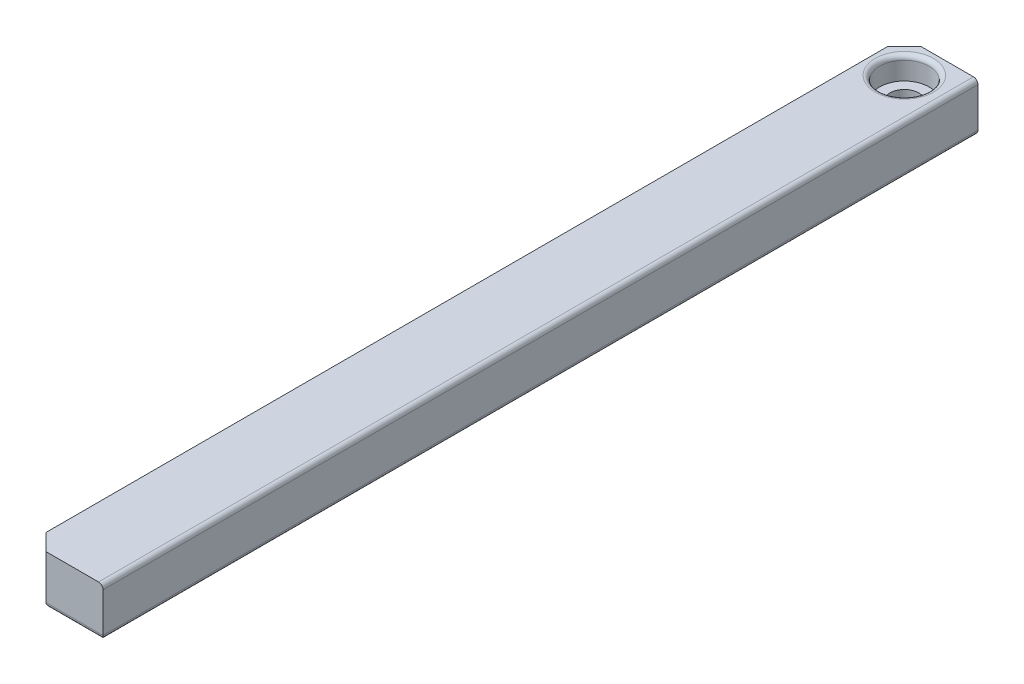
ISO-10303-21;
HEADER;
FILE_DESCRIPTION(('STEP AP214'),'2;1');
FILE_NAME('part.step','',(''),(''),'','','');
FILE_SCHEMA(('AUTOMOTIVE_DESIGN { 1 0 10303 214 1 1 1 1 }'));
ENDSEC;
DATA;
#1=APPLICATION_CONTEXT('core data for automotive mechanical design processes');
#2=APPLICATION_PROTOCOL_DEFINITION('international standard','automotive_design',2000,#1);
#3=PRODUCT_CONTEXT('',#1,'mechanical');
#4=PRODUCT('Part','Part','',(#3));
#5=PRODUCT_RELATED_PRODUCT_CATEGORY('part','',(#4));
#6=PRODUCT_DEFINITION_FORMATION('','',#4);
#7=PRODUCT_DEFINITION_CONTEXT('part definition',#1,'design');
#8=PRODUCT_DEFINITION('design','',#6,#7);
#9=PRODUCT_DEFINITION_SHAPE('','',#8);
#10=(LENGTH_UNIT() NAMED_UNIT(*) SI_UNIT(.MILLI.,.METRE.));
#11=(NAMED_UNIT(*) PLANE_ANGLE_UNIT() SI_UNIT($,.RADIAN.));
#12=(NAMED_UNIT(*) SI_UNIT($,.STERADIAN.) SOLID_ANGLE_UNIT());
#13=UNCERTAINTY_MEASURE_WITH_UNIT(LENGTH_MEASURE(1.E-05),#10,'distance_accuracy_value','');
#14=(GEOMETRIC_REPRESENTATION_CONTEXT(3) GLOBAL_UNCERTAINTY_ASSIGNED_CONTEXT((#13)) GLOBAL_UNIT_ASSIGNED_CONTEXT((#10,
#11,#12)) REPRESENTATION_CONTEXT('',''));
#15=CARTESIAN_POINT('',(0.,0.,0.));
#16=DIRECTION('',(0.,0.,1.));
#17=DIRECTION('',(1.,0.,0.));
#18=AXIS2_PLACEMENT_3D('',#15,#16,#17);
#19=CARTESIAN_POINT('',(25.459277076412,0.,-93.7));
#20=DIRECTION('',(0.,1.,0.));
#21=DIRECTION('',(0.,0.,1.));
#22=AXIS2_PLACEMENT_3D('',#19,#20,#21);
#23=CYLINDRICAL_SURFACE('',#22,1.6);
#24=CARTESIAN_POINT('',(25.459277076412,0.5,-93.7));
#25=DIRECTION('',(0.,1.,0.));
#26=DIRECTION('',(0.,0.,1.));
#27=AXIS2_PLACEMENT_3D('',#24,#25,#26);
#28=CIRCLE('',#27,1.6);
#29=CARTESIAN_POINT('',(25.459277076412,0.5,-92.1));
#30=VERTEX_POINT('',#29);
#31=EDGE_CURVE('E181',#30,#30,#28,.F.);
#32=CARTESIAN_POINT('',(25.459277076412,2.9,-93.7));
#33=DIRECTION('',(0.,1.,0.));
#34=DIRECTION('',(0.,0.,1.));
#35=AXIS2_PLACEMENT_3D('',#32,#33,#34);
#36=CIRCLE('',#35,1.6);
#37=CARTESIAN_POINT('',(25.459277076412,2.9,-92.1));
#38=VERTEX_POINT('',#37);
#39=EDGE_CURVE('E188',#38,#38,#36,.F.);
#40=CARTESIAN_POINT('',(25.459277076412,0.5,-92.1));
#41=CARTESIAN_POINT('',(25.459277076412,0.525,-92.1));
#42=CARTESIAN_POINT('',(25.459277076412,0.55,-92.1));
#43=CARTESIAN_POINT('',(25.459277076412,0.6,-92.1));
#44=CARTESIAN_POINT('',(25.459277076412,0.625,-92.1));
#45=CARTESIAN_POINT('',(25.459277076412,0.675,-92.1));
#46=CARTESIAN_POINT('',(25.459277076412,0.7,-92.1));
#47=CARTESIAN_POINT('',(25.459277076412,0.75,-92.1));
#48=CARTESIAN_POINT('',(25.459277076412,0.775,-92.1));
#49=CARTESIAN_POINT('',(25.459277076412,0.825,-92.1));
#50=CARTESIAN_POINT('',(25.459277076412,0.85,-92.1));
#51=CARTESIAN_POINT('',(25.459277076412,0.9,-92.1));
#52=CARTESIAN_POINT('',(25.459277076412,0.925,-92.1));
#53=CARTESIAN_POINT('',(25.459277076412,0.975,-92.1));
#54=CARTESIAN_POINT('',(25.459277076412,1.,-92.1));
#55=CARTESIAN_POINT('',(25.459277076412,1.05,-92.1));
#56=CARTESIAN_POINT('',(25.459277076412,1.075,-92.1));
#57=CARTESIAN_POINT('',(25.459277076412,1.125,-92.1));
#58=CARTESIAN_POINT('',(25.459277076412,1.15,-92.1));
#59=CARTESIAN_POINT('',(25.459277076412,1.2,-92.1));
#60=CARTESIAN_POINT('',(25.459277076412,1.225,-92.1));
#61=CARTESIAN_POINT('',(25.459277076412,1.275,-92.1));
#62=CARTESIAN_POINT('',(25.459277076412,1.3,-92.1));
#63=CARTESIAN_POINT('',(25.459277076412,1.35,-92.1));
#64=CARTESIAN_POINT('',(25.459277076412,1.375,-92.1));
#65=CARTESIAN_POINT('',(25.459277076412,1.425,-92.1));
#66=CARTESIAN_POINT('',(25.459277076412,1.45,-92.1));
#67=CARTESIAN_POINT('',(25.459277076412,1.5,-92.1));
#68=CARTESIAN_POINT('',(25.459277076412,1.525,-92.1));
#69=CARTESIAN_POINT('',(25.459277076412,1.575,-92.1));
#70=CARTESIAN_POINT('',(25.459277076412,1.6,-92.1));
#71=CARTESIAN_POINT('',(25.459277076412,1.65,-92.1));
#72=CARTESIAN_POINT('',(25.459277076412,1.675,-92.1));
#73=CARTESIAN_POINT('',(25.459277076412,1.725,-92.1));
#74=CARTESIAN_POINT('',(25.459277076412,1.75,-92.1));
#75=CARTESIAN_POINT('',(25.459277076412,1.8,-92.1));
#76=CARTESIAN_POINT('',(25.459277076412,1.825,-92.1));
#77=CARTESIAN_POINT('',(25.459277076412,1.875,-92.1));
#78=CARTESIAN_POINT('',(25.459277076412,1.9,-92.1));
#79=CARTESIAN_POINT('',(25.459277076412,1.95,-92.1));
#80=CARTESIAN_POINT('',(25.459277076412,1.975,-92.1));
#81=CARTESIAN_POINT('',(25.459277076412,2.025,-92.1));
#82=CARTESIAN_POINT('',(25.459277076412,2.05,-92.1));
#83=CARTESIAN_POINT('',(25.459277076412,2.1,-92.1));
#84=CARTESIAN_POINT('',(25.459277076412,2.125,-92.1));
#85=CARTESIAN_POINT('',(25.459277076412,2.175,-92.1));
#86=CARTESIAN_POINT('',(25.459277076412,2.2,-92.1));
#87=CARTESIAN_POINT('',(25.459277076412,2.25,-92.1));
#88=CARTESIAN_POINT('',(25.459277076412,2.275,-92.1));
#89=CARTESIAN_POINT('',(25.459277076412,2.325,-92.1));
#90=CARTESIAN_POINT('',(25.459277076412,2.35,-92.1));
#91=CARTESIAN_POINT('',(25.459277076412,2.4,-92.1));
#92=CARTESIAN_POINT('',(25.459277076412,2.425,-92.1));
#93=CARTESIAN_POINT('',(25.459277076412,2.475,-92.1));
#94=CARTESIAN_POINT('',(25.459277076412,2.5,-92.1));
#95=CARTESIAN_POINT('',(25.459277076412,2.55,-92.1));
#96=CARTESIAN_POINT('',(25.459277076412,2.575,-92.1));
#97=CARTESIAN_POINT('',(25.459277076412,2.625,-92.1));
#98=CARTESIAN_POINT('',(25.459277076412,2.65,-92.1));
#99=CARTESIAN_POINT('',(25.459277076412,2.7,-92.1));
#100=CARTESIAN_POINT('',(25.459277076412,2.725,-92.1));
#101=CARTESIAN_POINT('',(25.459277076412,2.775,-92.1));
#102=CARTESIAN_POINT('',(25.459277076412,2.8,-92.1));
#103=CARTESIAN_POINT('',(25.459277076412,2.85,-92.1));
#104=CARTESIAN_POINT('',(25.459277076412,2.875,-92.1));
#105=CARTESIAN_POINT('',(25.459277076412,2.9,-92.1));
#106=B_SPLINE_CURVE_WITH_KNOTS('',3,(#40,#41,#42,#43,#44,#45,#46,#47,#48,#49,#50,#51,#52,#53,
#54,#55,#56,#57,#58,#59,#60,#61,#62,#63,#64,#65,#66,#67,#68,#69,#70,#71,#72,#73,#74,#75,#76,#77,
#78,#79,#80,#81,#82,#83,#84,#85,#86,#87,#88,#89,#90,#91,#92,#93,#94,#95,#96,#97,#98,#99,#100,
#101,#102,#103,#104,#105),.UNSPECIFIED.,.F.,.F.,(4,2,2,2,2,2,2,2,2,2,2,2,2,2,2,2,2,2,2,2,2,2,2,
2,2,2,2,2,2,2,2,2,4),(0.,0.075,0.15,0.225,0.3,0.375,0.45,0.525,0.6,0.675,0.75,0.825,0.9,0.975,
1.05,1.125,1.2,1.275,1.35,1.425,1.5,1.575,1.65,1.725,1.8,1.875,1.95,2.025,2.1,2.175,2.25,2.325,
2.4),.UNSPECIFIED.);
#107=EDGE_CURVE('BSEAM35',#30,#38,#106,.T.);
#108=ORIENTED_EDGE('',*,*,#31,.T.);
#109=ORIENTED_EDGE('',*,*,#39,.F.);
#110=ORIENTED_EDGE('',*,*,#107,.T.);
#111=ORIENTED_EDGE('',*,*,#107,.F.);
#112=EDGE_LOOP('',(#108,#110,#109,#111));
#113=FACE_BOUND('',#112,.T.);
#114=ADVANCED_FACE('F35',(#113),#23,.F.);
#115=CARTESIAN_POINT('',(21.759277076412,5.4,-97.4));
#116=DIRECTION('',(1.,0.,0.));
#117=DIRECTION('',(0.,0.,-1.));
#118=AXIS2_PLACEMENT_3D('',#115,#116,#117);
#119=PLANE('',#118);
#120=DIRECTION('',(0.,1.,0.));
#121=VECTOR('',#120,1.);
#122=CARTESIAN_POINT('',(21.759277076412,0.,-95.55));
#123=LINE('',#122,#121);
#124=CARTESIAN_POINT('',(21.759277076412,0.5,-95.55));
#125=VERTEX_POINT('',#124);
#126=CARTESIAN_POINT('',(21.759277076412,5.4,-95.55));
#127=VERTEX_POINT('',#126);
#128=EDGE_CURVE('E112',#125,#127,#123,.T.);
#129=ORIENTED_EDGE('',*,*,#128,.F.);
#130=DIRECTION('',(0.,0.,1.));
#131=VECTOR('',#130,1.);
#132=CARTESIAN_POINT('',(21.759277076412,0.5,-97.4));
#133=LINE('',#132,#131);
#134=CARTESIAN_POINT('',(21.759277076412,0.5,-1.85));
#135=VERTEX_POINT('',#134);
#136=EDGE_CURVE('E179',#125,#135,#133,.T.);
#137=ORIENTED_EDGE('',*,*,#136,.T.);
#138=DIRECTION('',(0.,1.,0.));
#139=VECTOR('',#138,1.);
#140=CARTESIAN_POINT('',(21.759277076412,0.,-1.85));
#141=LINE('',#140,#139);
#142=CARTESIAN_POINT('',(21.759277076412,5.4,-1.85));
#143=VERTEX_POINT('',#142);
#144=EDGE_CURVE('E133',#135,#143,#141,.T.);
#145=ORIENTED_EDGE('',*,*,#144,.T.);
#146=DIRECTION('',(0.,0.,1.));
#147=VECTOR('',#146,1.);
#148=CARTESIAN_POINT('',(21.759277076412,5.4,-97.4));
#149=LINE('',#148,#147);
#150=EDGE_CURVE('E129',#127,#143,#149,.T.);
#151=ORIENTED_EDGE('',*,*,#150,.F.);
#152=EDGE_LOOP('',(#129,#137,#145,#151));
#153=FACE_BOUND('',#152,.T.);
#154=ADVANCED_FACE('F135',(#153),#119,.F.);
#155=CARTESIAN_POINT('',(21.759277076412,5.4,0.));
#156=DIRECTION('',(0.,0.,-1.));
#157=DIRECTION('',(-1.,0.,0.));
#158=AXIS2_PLACEMENT_3D('',#155,#156,#157);
#159=PLANE('',#158);
#160=DIRECTION('',(0.,-1.,0.));
#161=VECTOR('',#160,1.);
#162=CARTESIAN_POINT('',(29.959277076412,5.4,0.));
#163=LINE('',#162,#161);
#164=CARTESIAN_POINT('',(29.959277076412,4.9,0.));
#165=VERTEX_POINT('',#164);
#166=CARTESIAN_POINT('',(29.959277076412,0.500000000000002,0.));
#167=VERTEX_POINT('',#166);
#168=EDGE_CURVE('E149',#165,#167,#163,.T.);
#169=ORIENTED_EDGE('',*,*,#168,.F.);
#170=CARTESIAN_POINT('',(29.459277076412,4.9,0.));
#171=DIRECTION('',(0.,0.,-1.));
#172=DIRECTION('',(-1.,0.,0.));
#173=AXIS2_PLACEMENT_3D('',#170,#171,#172);
#174=CIRCLE('',#173,0.5);
#175=CARTESIAN_POINT('',(29.459277076412,5.4,0.));
#176=VERTEX_POINT('',#175);
#177=EDGE_CURVE('E206',#165,#176,#174,.F.);
#178=ORIENTED_EDGE('',*,*,#177,.T.);
#179=DIRECTION('',(1.,0.,0.));
#180=VECTOR('',#179,1.);
#181=CARTESIAN_POINT('',(21.759277076412,5.4,0.));
#182=LINE('',#181,#180);
#183=CARTESIAN_POINT('',(23.609277076412,5.4,0.));
#184=VERTEX_POINT('',#183);
#185=EDGE_CURVE('E138',#184,#176,#182,.T.);
#186=ORIENTED_EDGE('',*,*,#185,.F.);
#187=DIRECTION('',(0.,1.,0.));
#188=VECTOR('',#187,1.);
#189=CARTESIAN_POINT('',(23.609277076412,0.,0.));
#190=LINE('',#189,#188);
#191=CARTESIAN_POINT('',(23.609277076412,0.5,0.));
#192=VERTEX_POINT('',#191);
#193=EDGE_CURVE('E143',#192,#184,#190,.T.);
#194=ORIENTED_EDGE('',*,*,#193,.F.);
#195=DIRECTION('',(1.,0.,0.));
#196=VECTOR('',#195,1.);
#197=CARTESIAN_POINT('',(21.759277076412,0.5,0.));
#198=LINE('',#197,#196);
#199=EDGE_CURVE('E170',#192,#167,#198,.T.);
#200=ORIENTED_EDGE('',*,*,#199,.T.);
#201=EDGE_LOOP('',(#169,#178,#186,#194,#200));
#202=FACE_BOUND('',#201,.T.);
#203=ADVANCED_FACE('F230',(#202),#159,.F.);
#204=CARTESIAN_POINT('',(29.959277076412,5.4,0.));
#205=DIRECTION('',(-1.,0.,0.));
#206=DIRECTION('',(0.,0.,1.));
#207=AXIS2_PLACEMENT_3D('',#204,#205,#206);
#208=PLANE('',#207);
#209=DIRECTION('',(0.,-1.,0.));
#210=VECTOR('',#209,1.);
#211=CARTESIAN_POINT('',(29.959277076412,5.4,-97.4));
#212=LINE('',#211,#210);
#213=CARTESIAN_POINT('',(29.959277076412,4.9,-97.4));
#214=VERTEX_POINT('',#213);
#215=CARTESIAN_POINT('',(29.959277076412,0.500000000000002,-97.4));
#216=VERTEX_POINT('',#215);
#217=EDGE_CURVE('E147',#214,#216,#212,.T.);
#218=ORIENTED_EDGE('',*,*,#217,.F.);
#219=DIRECTION('',(0.,0.,-1.));
#220=VECTOR('',#219,1.);
#221=CARTESIAN_POINT('',(29.959277076412,4.9,0.));
#222=LINE('',#221,#220);
#223=EDGE_CURVE('E50',#214,#165,#222,.F.);
#224=ORIENTED_EDGE('',*,*,#223,.T.);
#225=ORIENTED_EDGE('',*,*,#168,.T.);
#226=DIRECTION('',(0.,0.,-1.));
#227=VECTOR('',#226,1.);
#228=CARTESIAN_POINT('',(29.959277076412,0.5,0.));
#229=LINE('',#228,#227);
#230=EDGE_CURVE('E173',#167,#216,#229,.T.);
#231=ORIENTED_EDGE('',*,*,#230,.T.);
#232=EDGE_LOOP('',(#218,#224,#225,#231));
#233=FACE_BOUND('',#232,.T.);
#234=ADVANCED_FACE('F247',(#233),#208,.F.);
#235=CARTESIAN_POINT('',(29.959277076412,5.4,-97.4));
#236=DIRECTION('',(0.,0.,1.));
#237=DIRECTION('',(1.,0.,0.));
#238=AXIS2_PLACEMENT_3D('',#235,#236,#237);
#239=PLANE('',#238);
#240=DIRECTION('',(-1.,0.,0.));
#241=VECTOR('',#240,1.);
#242=CARTESIAN_POINT('',(29.959277076412,5.4,-97.4));
#243=LINE('',#242,#241);
#244=CARTESIAN_POINT('',(29.459277076412,5.4,-97.4));
#245=VERTEX_POINT('',#244);
#246=CARTESIAN_POINT('',(23.609277076412,5.4,-97.4));
#247=VERTEX_POINT('',#246);
#248=EDGE_CURVE('E131',#245,#247,#243,.T.);
#249=ORIENTED_EDGE('',*,*,#248,.F.);
#250=CARTESIAN_POINT('',(29.459277076412,4.9,-97.4));
#251=DIRECTION('',(0.,0.,1.));
#252=DIRECTION('',(1.,0.,0.));
#253=AXIS2_PLACEMENT_3D('',#250,#251,#252);
#254=CIRCLE('',#253,0.5);
#255=EDGE_CURVE('E58',#245,#214,#254,.F.);
#256=ORIENTED_EDGE('',*,*,#255,.T.);
#257=ORIENTED_EDGE('',*,*,#217,.T.);
#258=DIRECTION('',(-1.,0.,0.));
#259=VECTOR('',#258,1.);
#260=CARTESIAN_POINT('',(29.959277076412,0.5,-97.4));
#261=LINE('',#260,#259);
#262=CARTESIAN_POINT('',(23.609277076412,0.5,-97.4));
#263=VERTEX_POINT('',#262);
#264=EDGE_CURVE('E176',#216,#263,#261,.T.);
#265=ORIENTED_EDGE('',*,*,#264,.T.);
#266=DIRECTION('',(0.,1.,0.));
#267=VECTOR('',#266,1.);
#268=CARTESIAN_POINT('',(23.609277076412,0.,-97.4));
#269=LINE('',#268,#267);
#270=EDGE_CURVE('E122',#263,#247,#269,.T.);
#271=ORIENTED_EDGE('',*,*,#270,.T.);
#272=EDGE_LOOP('',(#249,#256,#257,#265,#271));
#273=FACE_BOUND('',#272,.T.);
#274=ADVANCED_FACE('F240',(#273),#239,.F.);
#275=CARTESIAN_POINT('',(0.,5.4,0.));
#276=DIRECTION('',(0.,1.,0.));
#277=DIRECTION('',(0.,0.,1.));
#278=AXIS2_PLACEMENT_3D('',#275,#276,#277);
#279=PLANE('',#278);
#280=CARTESIAN_POINT('',(25.459277076412,5.4,-93.7));
#281=DIRECTION('',(0.,1.,0.));
#282=DIRECTION('',(0.,0.,1.));
#283=AXIS2_PLACEMENT_3D('',#280,#281,#282);
#284=CIRCLE('',#283,3.25);
#285=CARTESIAN_POINT('',(25.459277076412,5.4,-90.45));
#286=VERTEX_POINT('',#285);
#287=EDGE_CURVE('E11',#286,#286,#284,.F.);
#288=ORIENTED_EDGE('',*,*,#287,.T.);
#289=EDGE_LOOP('',(#288));
#290=FACE_BOUND('',#289,.T.);
#291=ORIENTED_EDGE('',*,*,#185,.T.);
#292=DIRECTION('',(0.,0.,-1.));
#293=VECTOR('',#292,1.);
#294=CARTESIAN_POINT('',(29.459277076412,5.4,-97.4));
#295=LINE('',#294,#293);
#296=EDGE_CURVE('E184',#176,#245,#295,.T.);
#297=ORIENTED_EDGE('',*,*,#296,.T.);
#298=ORIENTED_EDGE('',*,*,#248,.T.);
#299=DIRECTION('',(0.707106781186547,0.,-0.707106781186548));
#300=VECTOR('',#299,1.);
#301=CARTESIAN_POINT('',(21.759277076412,5.4,-95.55));
#302=LINE('',#301,#300);
#303=EDGE_CURVE('E116',#127,#247,#302,.T.);
#304=ORIENTED_EDGE('',*,*,#303,.F.);
#305=ORIENTED_EDGE('',*,*,#150,.T.);
#306=DIRECTION('',(-0.707106781186547,0.,-0.707106781186548));
#307=VECTOR('',#306,1.);
#308=CARTESIAN_POINT('',(21.759277076412,5.4,-1.85));
#309=LINE('',#308,#307);
#310=EDGE_CURVE('E202',#184,#143,#309,.T.);
#311=ORIENTED_EDGE('',*,*,#310,.F.);
#312=EDGE_LOOP('',(#291,#297,#298,#304,#305,#311));
#313=FACE_BOUND('',#312,.T.);
#314=ADVANCED_FACE('F127',(#290,#313),#279,.T.);
#315=CARTESIAN_POINT('',(0.,0.,0.));
#316=DIRECTION('',(0.,1.,0.));
#317=DIRECTION('',(0.,0.,1.));
#318=AXIS2_PLACEMENT_3D('',#315,#316,#317);
#319=PLANE('',#318);
#320=DIRECTION('',(1.,0.,0.));
#321=VECTOR('',#320,1.);
#322=CARTESIAN_POINT('',(0.,0.,-0.5));
#323=LINE('',#322,#321);
#324=CARTESIAN_POINT('',(29.459277076412,0.,-0.5));
#325=VERTEX_POINT('',#324);
#326=CARTESIAN_POINT('',(23.8163838575986,0.,-0.5));
#327=VERTEX_POINT('',#326);
#328=EDGE_CURVE('E162',#325,#327,#323,.F.);
#329=ORIENTED_EDGE('',*,*,#328,.T.);
#330=DIRECTION('',(-0.707106781186547,0.,-0.707106781186548));
#331=VECTOR('',#330,1.);
#332=CARTESIAN_POINT('',(12.1581919287993,0.,-12.1581919287993));
#333=LINE('',#332,#331);
#334=CARTESIAN_POINT('',(22.259277076412,0.,-2.05710678118655));
#335=VERTEX_POINT('',#334);
#336=EDGE_CURVE('E164',#327,#335,#333,.T.);
#337=ORIENTED_EDGE('',*,*,#336,.T.);
#338=DIRECTION('',(0.,0.,1.));
#339=VECTOR('',#338,1.);
#340=CARTESIAN_POINT('',(22.259277076412,0.,0.));
#341=LINE('',#340,#339);
#342=CARTESIAN_POINT('',(22.259277076412,0.,-95.3428932188135));
#343=VERTEX_POINT('',#342);
#344=EDGE_CURVE('E154',#335,#343,#341,.F.);
#345=ORIENTED_EDGE('',*,*,#344,.T.);
#346=DIRECTION('',(0.707106781186547,0.,-0.707106781186548));
#347=VECTOR('',#346,1.);
#348=CARTESIAN_POINT('',(-36.5418080712007,0.,-36.5418080712006));
#349=LINE('',#348,#347);
#350=CARTESIAN_POINT('',(23.8163838575986,0.,-96.9));
#351=VERTEX_POINT('',#350);
#352=EDGE_CURVE('E156',#343,#351,#349,.T.);
#353=ORIENTED_EDGE('',*,*,#352,.T.);
#354=DIRECTION('',(-1.,0.,0.));
#355=VECTOR('',#354,1.);
#356=CARTESIAN_POINT('',(0.,0.,-96.9));
#357=LINE('',#356,#355);
#358=CARTESIAN_POINT('',(29.459277076412,0.,-96.9));
#359=VERTEX_POINT('',#358);
#360=EDGE_CURVE('E158',#351,#359,#357,.F.);
#361=ORIENTED_EDGE('',*,*,#360,.T.);
#362=DIRECTION('',(0.,0.,-1.));
#363=VECTOR('',#362,1.);
#364=CARTESIAN_POINT('',(29.459277076412,0.,0.));
#365=LINE('',#364,#363);
#366=EDGE_CURVE('E160',#359,#325,#365,.F.);
#367=ORIENTED_EDGE('',*,*,#366,.T.);
#368=EDGE_LOOP('',(#329,#337,#345,#353,#361,#367));
#369=FACE_BOUND('',#368,.T.);
#370=CARTESIAN_POINT('',(25.459277076412,0.,-93.7));
#371=DIRECTION('',(0.,1.,0.));
#372=DIRECTION('',(0.,0.,1.));
#373=AXIS2_PLACEMENT_3D('',#370,#371,#372);
#374=CIRCLE('',#373,2.1);
#375=CARTESIAN_POINT('',(25.459277076412,0.,-91.6));
#376=VERTEX_POINT('',#375);
#377=EDGE_CURVE('E151',#376,#376,#374,.T.);
#378=ORIENTED_EDGE('',*,*,#377,.T.);
#379=EDGE_LOOP('',(#378));
#380=FACE_BOUND('',#379,.T.);
#381=ADVANCED_FACE('F239',(#369,#380),#319,.F.);
#382=CARTESIAN_POINT('',(21.759277076412,0.,-1.85));
#383=DIRECTION('',(0.707106781186548,0.,-0.707106781186547));
#384=DIRECTION('',(-0.707106781186547,0.,-0.707106781186548));
#385=AXIS2_PLACEMENT_3D('',#382,#383,#384);
#386=PLANE('',#385);
#387=ORIENTED_EDGE('',*,*,#144,.F.);
#388=DIRECTION('',(-0.707106781186547,0.,-0.707106781186548));
#389=VECTOR('',#388,1.);
#390=CARTESIAN_POINT('',(21.759277076412,0.5,-1.85));
#391=LINE('',#390,#389);
#392=EDGE_CURVE('E167',#135,#192,#391,.F.);
#393=ORIENTED_EDGE('',*,*,#392,.T.);
#394=ORIENTED_EDGE('',*,*,#193,.T.);
#395=ORIENTED_EDGE('',*,*,#310,.T.);
#396=EDGE_LOOP('',(#387,#393,#394,#395));
#397=FACE_BOUND('',#396,.T.);
#398=ADVANCED_FACE('F235',(#397),#386,.F.);
#399=CARTESIAN_POINT('',(21.759277076412,0.,-95.55));
#400=DIRECTION('',(0.707106781186548,0.,0.707106781186547));
#401=DIRECTION('',(0.707106781186547,0.,-0.707106781186548));
#402=AXIS2_PLACEMENT_3D('',#399,#400,#401);
#403=PLANE('',#402);
#404=ORIENTED_EDGE('',*,*,#270,.F.);
#405=DIRECTION('',(0.707106781186547,0.,-0.707106781186548));
#406=VECTOR('',#405,1.);
#407=CARTESIAN_POINT('',(21.759277076412,0.5,-95.55));
#408=LINE('',#407,#406);
#409=EDGE_CURVE('E118',#263,#125,#408,.F.);
#410=ORIENTED_EDGE('',*,*,#409,.T.);
#411=ORIENTED_EDGE('',*,*,#128,.T.);
#412=ORIENTED_EDGE('',*,*,#303,.T.);
#413=EDGE_LOOP('',(#404,#410,#411,#412));
#414=FACE_BOUND('',#413,.T.);
#415=ADVANCED_FACE('F115',(#414),#403,.F.);
#416=CARTESIAN_POINT('',(29.959277076412,0.5,-96.9));
#417=DIRECTION('',(-1.,0.,0.));
#418=DIRECTION('',(0.,0.,1.));
#419=AXIS2_PLACEMENT_3D('',#416,#417,#418);
#420=CYLINDRICAL_SURFACE('',#419,0.5);
#421=CARTESIAN_POINT('',(23.8163838575986,0.5,-96.9));
#422=DIRECTION('',(0.923879532511287,0.,-0.38268343236509));
#423=DIRECTION('',(-0.38268343236509,0.,-0.923879532511287));
#424=AXIS2_PLACEMENT_3D('',#421,#422,#423);
#425=ELLIPSE('',#424,0.541196100146197,0.5);
#426=EDGE_CURVE('E196',#263,#351,#425,.F.);
#427=ORIENTED_EDGE('',*,*,#426,.F.);
#428=ORIENTED_EDGE('',*,*,#264,.F.);
#429=CARTESIAN_POINT('',(29.459277076412,0.5,-96.9));
#430=DIRECTION('',(-0.707106781186547,0.,-0.707106781186547));
#431=DIRECTION('',(-0.707106781186547,0.,0.707106781186547));
#432=AXIS2_PLACEMENT_3D('',#429,#430,#431);
#433=ELLIPSE('',#432,0.707106781186547,0.5);
#434=EDGE_CURVE('E199',#359,#216,#433,.F.);
#435=ORIENTED_EDGE('',*,*,#434,.F.);
#436=ORIENTED_EDGE('',*,*,#360,.F.);
#437=EDGE_LOOP('',(#427,#428,#435,#436));
#438=FACE_BOUND('',#437,.T.);
#439=ADVANCED_FACE('F273',(#438),#420,.T.);
#440=CARTESIAN_POINT('',(29.459277076412,0.5,0.));
#441=DIRECTION('',(0.,0.,-1.));
#442=DIRECTION('',(-1.,0.,0.));
#443=AXIS2_PLACEMENT_3D('',#440,#441,#442);
#444=CYLINDRICAL_SURFACE('',#443,0.5);
#445=ORIENTED_EDGE('',*,*,#434,.T.);
#446=ORIENTED_EDGE('',*,*,#230,.F.);
#447=CARTESIAN_POINT('',(29.459277076412,0.5,-0.5));
#448=DIRECTION('',(0.707106781186547,0.,-0.707106781186547));
#449=DIRECTION('',(-0.707106781186547,0.,-0.707106781186547));
#450=AXIS2_PLACEMENT_3D('',#447,#448,#449);
#451=ELLIPSE('',#450,0.707106781186547,0.5);
#452=EDGE_CURVE('E193',#325,#167,#451,.F.);
#453=ORIENTED_EDGE('',*,*,#452,.F.);
#454=ORIENTED_EDGE('',*,*,#366,.F.);
#455=EDGE_LOOP('',(#445,#446,#453,#454));
#456=FACE_BOUND('',#455,.T.);
#457=ADVANCED_FACE('F269',(#456),#444,.T.);
#458=CARTESIAN_POINT('',(-36.5418080712007,0.5,-36.5418080712006));
#459=DIRECTION('',(0.707106781186547,0.,-0.707106781186548));
#460=DIRECTION('',(-0.707106781186548,0.,-0.707106781186547));
#461=AXIS2_PLACEMENT_3D('',#458,#459,#460);
#462=CYLINDRICAL_SURFACE('',#461,0.5);
#463=ORIENTED_EDGE('',*,*,#426,.T.);
#464=ORIENTED_EDGE('',*,*,#352,.F.);
#465=CARTESIAN_POINT('',(22.259277076412,0.5,-95.3428932188135));
#466=DIRECTION('',(-0.382683432365089,0.,0.923879532511287));
#467=DIRECTION('',(0.923879532511287,0.,0.382683432365089));
#468=AXIS2_PLACEMENT_3D('',#465,#466,#467);
#469=ELLIPSE('',#468,0.541196100146197,0.5);
#470=EDGE_CURVE('E190',#125,#343,#469,.T.);
#471=ORIENTED_EDGE('',*,*,#470,.F.);
#472=ORIENTED_EDGE('',*,*,#409,.F.);
#473=EDGE_LOOP('',(#463,#464,#471,#472));
#474=FACE_BOUND('',#473,.T.);
#475=ADVANCED_FACE('F265',(#474),#462,.T.);
#476=CARTESIAN_POINT('',(21.759277076412,0.5,-0.5));
#477=DIRECTION('',(1.,0.,0.));
#478=DIRECTION('',(0.,0.,-1.));
#479=AXIS2_PLACEMENT_3D('',#476,#477,#478);
#480=CYLINDRICAL_SURFACE('',#479,0.5);
#481=ORIENTED_EDGE('',*,*,#452,.T.);
#482=ORIENTED_EDGE('',*,*,#199,.F.);
#483=CARTESIAN_POINT('',(23.8163838575986,0.5,-0.499999999999999));
#484=DIRECTION('',(0.923879532511287,0.,0.38268343236509));
#485=DIRECTION('',(0.38268343236509,0.,-0.923879532511287));
#486=AXIS2_PLACEMENT_3D('',#483,#484,#485);
#487=ELLIPSE('',#486,0.541196100146197,0.5);
#488=EDGE_CURVE('E187',#327,#192,#487,.F.);
#489=ORIENTED_EDGE('',*,*,#488,.F.);
#490=ORIENTED_EDGE('',*,*,#328,.F.);
#491=EDGE_LOOP('',(#481,#482,#489,#490));
#492=FACE_BOUND('',#491,.T.);
#493=ADVANCED_FACE('F261',(#492),#480,.T.);
#494=CARTESIAN_POINT('',(22.259277076412,0.5,-97.4));
#495=DIRECTION('',(0.,0.,1.));
#496=DIRECTION('',(1.,0.,0.));
#497=AXIS2_PLACEMENT_3D('',#494,#495,#496);
#498=CYLINDRICAL_SURFACE('',#497,0.5);
#499=ORIENTED_EDGE('',*,*,#470,.T.);
#500=ORIENTED_EDGE('',*,*,#344,.F.);
#501=CARTESIAN_POINT('',(22.259277076412,0.5,-2.05710678118655));
#502=DIRECTION('',(0.382683432365089,0.,0.923879532511287));
#503=DIRECTION('',(-0.923879532511287,0.,0.382683432365089));
#504=AXIS2_PLACEMENT_3D('',#501,#502,#503);
#505=ELLIPSE('',#504,0.541196100146197,0.5);
#506=EDGE_CURVE('E185',#135,#335,#505,.T.);
#507=ORIENTED_EDGE('',*,*,#506,.F.);
#508=ORIENTED_EDGE('',*,*,#136,.F.);
#509=EDGE_LOOP('',(#499,#500,#507,#508));
#510=FACE_BOUND('',#509,.T.);
#511=ADVANCED_FACE('F257',(#510),#498,.T.);
#512=CARTESIAN_POINT('',(12.1581919287993,0.5,-12.1581919287993));
#513=DIRECTION('',(-0.707106781186547,0.,-0.707106781186548));
#514=DIRECTION('',(-0.707106781186548,0.,0.707106781186547));
#515=AXIS2_PLACEMENT_3D('',#512,#513,#514);
#516=CYLINDRICAL_SURFACE('',#515,0.5);
#517=ORIENTED_EDGE('',*,*,#488,.T.);
#518=ORIENTED_EDGE('',*,*,#392,.F.);
#519=ORIENTED_EDGE('',*,*,#506,.T.);
#520=ORIENTED_EDGE('',*,*,#336,.F.);
#521=EDGE_LOOP('',(#517,#518,#519,#520));
#522=FACE_BOUND('',#521,.T.);
#523=ADVANCED_FACE('F253',(#522),#516,.T.);
#524=CARTESIAN_POINT('',(25.459277076412,0.5,-93.7));
#525=DIRECTION('',(0.,1.,0.));
#526=DIRECTION('',(0.,0.,1.));
#527=AXIS2_PLACEMENT_3D('',#524,#525,#526);
#528=TOROIDAL_SURFACE('',#527,2.1,0.5);
#529=ORIENTED_EDGE('',*,*,#31,.F.);
#530=EDGE_LOOP('',(#529));
#531=FACE_BOUND('',#530,.T.);
#532=ORIENTED_EDGE('',*,*,#377,.F.);
#533=EDGE_LOOP('',(#532));
#534=FACE_BOUND('',#533,.T.);
#535=ADVANCED_FACE('F256',(#531,#534),#528,.T.);
#536=CARTESIAN_POINT('',(29.459277076412,4.9,0.));
#537=DIRECTION('',(0.,0.,1.));
#538=DIRECTION('',(1.,0.,0.));
#539=AXIS2_PLACEMENT_3D('',#536,#537,#538);
#540=CYLINDRICAL_SURFACE('',#539,0.5);
#541=ORIENTED_EDGE('',*,*,#177,.F.);
#542=ORIENTED_EDGE('',*,*,#223,.F.);
#543=ORIENTED_EDGE('',*,*,#255,.F.);
#544=ORIENTED_EDGE('',*,*,#296,.F.);
#545=EDGE_LOOP('',(#541,#542,#543,#544));
#546=FACE_BOUND('',#545,.T.);
#547=ADVANCED_FACE('F279',(#546),#540,.T.);
#548=CARTESIAN_POINT('',(25.459277076412,2.9,-93.7));
#549=DIRECTION('',(0.,1.,0.));
#550=DIRECTION('',(0.,0.,1.));
#551=AXIS2_PLACEMENT_3D('',#548,#549,#550);
#552=PLANE('',#551);
#553=CARTESIAN_POINT('',(25.459277076412,2.9,-93.7));
#554=DIRECTION('',(0.,1.,0.));
#555=DIRECTION('',(0.,0.,1.));
#556=AXIS2_PLACEMENT_3D('',#553,#554,#555);
#557=CIRCLE('',#556,2.75);
#558=CARTESIAN_POINT('',(25.459277076412,2.9,-90.95));
#559=VERTEX_POINT('',#558);
#560=EDGE_CURVE('E209',#559,#559,#557,.T.);
#561=ORIENTED_EDGE('',*,*,#560,.T.);
#562=EDGE_LOOP('',(#561));
#563=FACE_BOUND('',#562,.T.);
#564=ORIENTED_EDGE('',*,*,#39,.T.);
#565=EDGE_LOOP('',(#564));
#566=FACE_BOUND('',#565,.T.);
#567=ADVANCED_FACE('F221',(#563,#566),#552,.T.);
#568=CARTESIAN_POINT('',(25.459277076412,2.9,-93.7));
#569=DIRECTION('',(0.,1.,0.));
#570=DIRECTION('',(0.,0.,1.));
#571=AXIS2_PLACEMENT_3D('',#568,#569,#570);
#572=CYLINDRICAL_SURFACE('',#571,2.75);
#573=CARTESIAN_POINT('',(25.459277076412,4.9,-93.7));
#574=DIRECTION('',(0.,1.,0.));
#575=DIRECTION('',(0.,0.,1.));
#576=AXIS2_PLACEMENT_3D('',#573,#574,#575);
#577=CIRCLE('',#576,2.75);
#578=CARTESIAN_POINT('',(25.459277076412,4.9,-90.95));
#579=VERTEX_POINT('',#578);
#580=EDGE_CURVE('E43',#579,#579,#577,.T.);
#581=ORIENTED_EDGE('',*,*,#580,.T.);
#582=EDGE_LOOP('',(#581));
#583=FACE_BOUND('',#582,.T.);
#584=ORIENTED_EDGE('',*,*,#560,.F.);
#585=EDGE_LOOP('',(#584));
#586=FACE_BOUND('',#585,.T.);
#587=ADVANCED_FACE('F213',(#583,#586),#572,.F.);
#588=CARTESIAN_POINT('',(25.459277076412,4.9,-93.7));
#589=DIRECTION('',(0.,1.,0.));
#590=DIRECTION('',(0.,0.,1.));
#591=AXIS2_PLACEMENT_3D('',#588,#589,#590);
#592=TOROIDAL_SURFACE('',#591,3.25,0.5);
#593=ORIENTED_EDGE('',*,*,#287,.F.);
#594=EDGE_LOOP('',(#593));
#595=FACE_BOUND('',#594,.T.);
#596=ORIENTED_EDGE('',*,*,#580,.F.);
#597=EDGE_LOOP('',(#596));
#598=FACE_BOUND('',#597,.T.);
#599=ADVANCED_FACE('F37',(#595,#598),#592,.T.);
#600=CLOSED_SHELL('',(#114,#154,#203,#234,#274,#314,#381,#398,#415,#439,#457,#475,#493,#511,
#523,#535,#547,#567,#587,#599));
#601=MANIFOLD_SOLID_BREP('B2',#600);
#602=ADVANCED_BREP_SHAPE_REPRESENTATION('',(#18,#601),#14);
#603=SHAPE_DEFINITION_REPRESENTATION(#9,#602);
ENDSEC;
END-ISO-10303-21;
